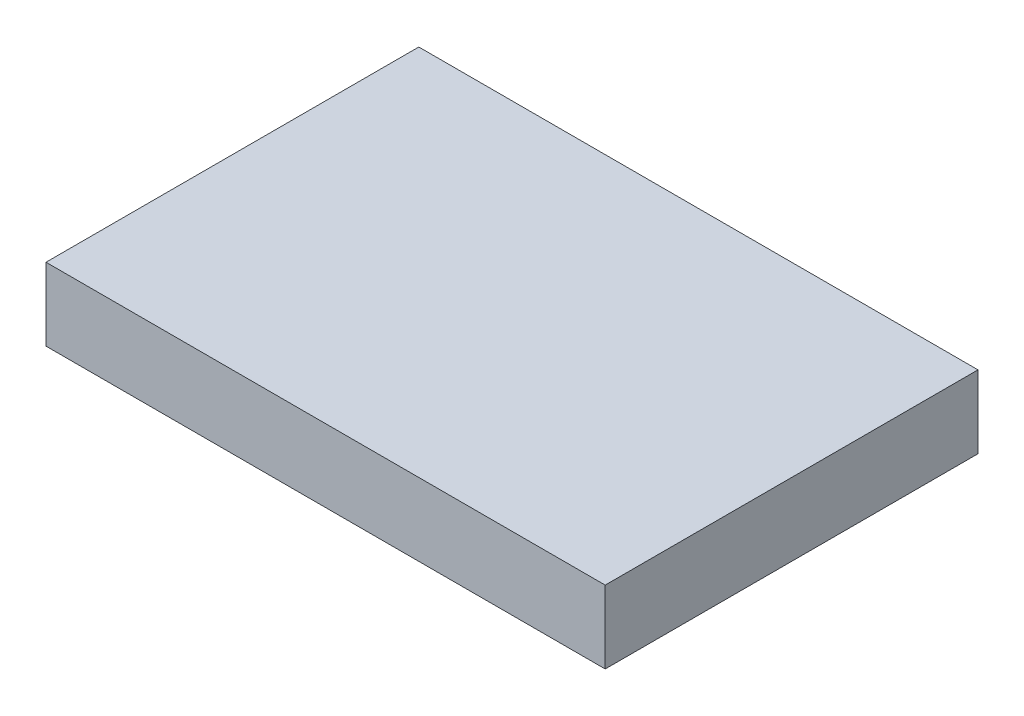
ISO-10303-21;
HEADER;
FILE_DESCRIPTION(('STEP AP214'),'2;1');
FILE_NAME('part.step','',(''),(''),'','','');
FILE_SCHEMA(('AUTOMOTIVE_DESIGN { 1 0 10303 214 1 1 1 1 }'));
ENDSEC;
DATA;
#1=APPLICATION_CONTEXT('core data for automotive mechanical design processes');
#2=APPLICATION_PROTOCOL_DEFINITION('international standard','automotive_design',2000,#1);
#3=PRODUCT_CONTEXT('',#1,'mechanical');
#4=PRODUCT('Part','Part','',(#3));
#5=PRODUCT_RELATED_PRODUCT_CATEGORY('part','',(#4));
#6=PRODUCT_DEFINITION_FORMATION('','',#4);
#7=PRODUCT_DEFINITION_CONTEXT('part definition',#1,'design');
#8=PRODUCT_DEFINITION('design','',#6,#7);
#9=PRODUCT_DEFINITION_SHAPE('','',#8);
#10=(LENGTH_UNIT() NAMED_UNIT(*) SI_UNIT(.MILLI.,.METRE.));
#11=(NAMED_UNIT(*) PLANE_ANGLE_UNIT() SI_UNIT($,.RADIAN.));
#12=(NAMED_UNIT(*) SI_UNIT($,.STERADIAN.) SOLID_ANGLE_UNIT());
#13=UNCERTAINTY_MEASURE_WITH_UNIT(LENGTH_MEASURE(1.E-05),#10,'distance_accuracy_value','');
#14=(GEOMETRIC_REPRESENTATION_CONTEXT(3) GLOBAL_UNCERTAINTY_ASSIGNED_CONTEXT((#13)) GLOBAL_UNIT_ASSIGNED_CONTEXT((#10,
#11,#12)) REPRESENTATION_CONTEXT('',''));
#15=CARTESIAN_POINT('',(0.,0.,0.));
#16=DIRECTION('',(0.,0.,1.));
#17=DIRECTION('',(1.,0.,0.));
#18=AXIS2_PLACEMENT_3D('',#15,#16,#17);
#19=CARTESIAN_POINT('',(0.,1.9,0.));
#20=DIRECTION('',(0.,-1.,0.));
#21=DIRECTION('',(0.,0.,-1.));
#22=AXIS2_PLACEMENT_3D('',#19,#20,#21);
#23=PLANE('',#22);
#24=CARTESIAN_POINT('',(-4.02500000000004,1.9,0.));
#25=DIRECTION('',(0.,-1.,0.));
#26=DIRECTION('',(0.,0.,-1.));
#27=AXIS2_PLACEMENT_3D('',#24,#25,#26);
#28=CIRCLE('',#27,2.4);
#29=CARTESIAN_POINT('',(-4.02500000000004,1.9,-2.40000000000009));
#30=VERTEX_POINT('',#29);
#31=EDGE_CURVE('E48',#30,#30,#28,.F.);
#32=ORIENTED_EDGE('',*,*,#31,.F.);
#33=EDGE_LOOP('',(#32));
#34=FACE_BOUND('',#33,.T.);
#35=ADVANCED_FACE('F39',(#34),#23,.T.);
#36=CARTESIAN_POINT('',(-4.02500000000004,-9.05096679918781,0.));
#37=DIRECTION('',(0.,1.,0.));
#38=DIRECTION('',(0.,0.,1.));
#39=AXIS2_PLACEMENT_3D('',#36,#37,#38);
#40=CYLINDRICAL_SURFACE('',#39,3.2);
#41=CARTESIAN_POINT('',(-4.02500000000004,1.9,0.));
#42=DIRECTION('',(0.,-1.,0.));
#43=DIRECTION('',(0.,0.,-1.));
#44=AXIS2_PLACEMENT_3D('',#41,#42,#43);
#45=CIRCLE('',#44,3.2);
#46=CARTESIAN_POINT('',(-4.02500000000004,1.9,-3.2000000000001));
#47=VERTEX_POINT('',#46);
#48=EDGE_CURVE('E11',#47,#47,#45,.T.);
#49=ORIENTED_EDGE('',*,*,#48,.T.);
#50=EDGE_LOOP('',(#49));
#51=FACE_BOUND('',#50,.T.);
#52=CARTESIAN_POINT('',(-4.02500000000004,0.,0.));
#53=DIRECTION('',(0.,-1.,0.));
#54=DIRECTION('',(0.,0.,-1.));
#55=AXIS2_PLACEMENT_3D('',#52,#53,#54);
#56=CIRCLE('',#55,3.2);
#57=CARTESIAN_POINT('',(-4.02500000000004,0.,-3.2000000000001));
#58=VERTEX_POINT('',#57);
#59=EDGE_CURVE('E213',#58,#58,#56,.T.);
#60=ORIENTED_EDGE('',*,*,#59,.F.);
#61=EDGE_LOOP('',(#60));
#62=FACE_BOUND('',#61,.T.);
#63=ADVANCED_FACE('F41',(#51,#62),#40,.T.);
#64=CARTESIAN_POINT('',(-4.02500000000004,-9.05096679918781,0.));
#65=DIRECTION('',(0.,1.,0.));
#66=DIRECTION('',(0.,0.,1.));
#67=AXIS2_PLACEMENT_3D('',#64,#65,#66);
#68=CYLINDRICAL_SURFACE('',#67,2.4);
#69=ORIENTED_EDGE('',*,*,#31,.T.);
#70=EDGE_LOOP('',(#69));
#71=FACE_BOUND('',#70,.T.);
#72=CARTESIAN_POINT('',(-4.02500000000004,0.,0.));
#73=DIRECTION('',(0.,-1.,0.));
#74=DIRECTION('',(0.,0.,-1.));
#75=AXIS2_PLACEMENT_3D('',#72,#73,#74);
#76=CIRCLE('',#75,2.4);
#77=CARTESIAN_POINT('',(-4.02500000000004,0.,-2.40000000000009));
#78=VERTEX_POINT('',#77);
#79=EDGE_CURVE('E209',#78,#78,#76,.T.);
#80=ORIENTED_EDGE('',*,*,#79,.T.);
#81=EDGE_LOOP('',(#80));
#82=FACE_BOUND('',#81,.T.);
#83=ADVANCED_FACE('F220',(#71,#82),#68,.F.);
#84=CARTESIAN_POINT('',(-8.,0.,0.));
#85=DIRECTION('',(0.,-1.,0.));
#86=DIRECTION('',(0.,0.,-1.));
#87=AXIS2_PLACEMENT_3D('',#84,#85,#86);
#88=PLANE('',#87);
#89=ORIENTED_EDGE('',*,*,#79,.F.);
#90=EDGE_LOOP('',(#89));
#91=FACE_BOUND('',#90,.T.);
#92=ORIENTED_EDGE('',*,*,#59,.T.);
#93=EDGE_LOOP('',(#92));
#94=FACE_BOUND('',#93,.T.);
#95=ADVANCED_FACE('F329',(#91,#94),#88,.T.);
#96=CARTESIAN_POINT('',(0.,0.,0.));
#97=DIRECTION('',(0.,-1.,0.));
#98=DIRECTION('',(0.,0.,-1.));
#99=AXIS2_PLACEMENT_3D('',#96,#97,#98);
#100=PLANE('',#99);
#101=DIRECTION('',(0.,0.,-1.));
#102=VECTOR('',#101,1.);
#103=CARTESIAN_POINT('',(11.925,0.,7.94999999999991));
#104=LINE('',#103,#102);
#105=CARTESIAN_POINT('',(11.925,0.,7.94999999999991));
#106=VERTEX_POINT('',#105);
#107=CARTESIAN_POINT('',(11.925,0.,-7.9500000000001));
#108=VERTEX_POINT('',#107);
#109=EDGE_CURVE('E141',#106,#108,#104,.T.);
#110=ORIENTED_EDGE('',*,*,#109,.F.);
#111=DIRECTION('',(1.,0.,0.));
#112=VECTOR('',#111,1.);
#113=CARTESIAN_POINT('',(-11.925,0.,7.94999999999991));
#114=LINE('',#113,#112);
#115=CARTESIAN_POINT('',(-11.925,0.,7.94999999999991));
#116=VERTEX_POINT('',#115);
#117=EDGE_CURVE('E85',#116,#106,#114,.T.);
#118=ORIENTED_EDGE('',*,*,#117,.F.);
#119=DIRECTION('',(0.,0.,1.));
#120=VECTOR('',#119,1.);
#121=CARTESIAN_POINT('',(-11.925,0.,7.94999999999991));
#122=LINE('',#121,#120);
#123=CARTESIAN_POINT('',(-11.925,0.,-7.9500000000001));
#124=VERTEX_POINT('',#123);
#125=EDGE_CURVE('E188',#124,#116,#122,.T.);
#126=ORIENTED_EDGE('',*,*,#125,.F.);
#127=DIRECTION('',(-1.,0.,0.));
#128=VECTOR('',#127,1.);
#129=CARTESIAN_POINT('',(-11.925,0.,-7.9500000000001));
#130=LINE('',#129,#128);
#131=EDGE_CURVE('E147',#108,#124,#130,.T.);
#132=ORIENTED_EDGE('',*,*,#131,.F.);
#133=EDGE_LOOP('',(#110,#118,#126,#132));
#134=FACE_BOUND('',#133,.T.);
#135=DIRECTION('',(1.,0.,0.));
#136=VECTOR('',#135,1.);
#137=CARTESIAN_POINT('',(0.,0.,6.7499999999999));
#138=LINE('',#137,#136);
#139=CARTESIAN_POINT('',(-10.725,0.,6.7499999999999));
#140=VERTEX_POINT('',#139);
#141=CARTESIAN_POINT('',(10.725,0.,6.7499999999999));
#142=VERTEX_POINT('',#141);
#143=EDGE_CURVE('E135',#140,#142,#138,.T.);
#144=ORIENTED_EDGE('',*,*,#143,.T.);
#145=DIRECTION('',(0.,0.,-1.));
#146=VECTOR('',#145,1.);
#147=CARTESIAN_POINT('',(10.725,0.,0.));
#148=LINE('',#147,#146);
#149=CARTESIAN_POINT('',(10.725,0.,-6.7500000000001));
#150=VERTEX_POINT('',#149);
#151=EDGE_CURVE('E164',#142,#150,#148,.T.);
#152=ORIENTED_EDGE('',*,*,#151,.T.);
#153=DIRECTION('',(-1.,0.,0.));
#154=VECTOR('',#153,1.);
#155=CARTESIAN_POINT('',(0.,0.,-6.7500000000001));
#156=LINE('',#155,#154);
#157=CARTESIAN_POINT('',(-10.725,0.,-6.7500000000001));
#158=VERTEX_POINT('',#157);
#159=EDGE_CURVE('E139',#150,#158,#156,.T.);
#160=ORIENTED_EDGE('',*,*,#159,.T.);
#161=DIRECTION('',(0.,0.,1.));
#162=VECTOR('',#161,1.);
#163=CARTESIAN_POINT('',(-10.725,0.,0.));
#164=LINE('',#163,#162);
#165=EDGE_CURVE('E55',#158,#140,#164,.T.);
#166=ORIENTED_EDGE('',*,*,#165,.T.);
#167=EDGE_LOOP('',(#144,#152,#160,#166));
#168=FACE_BOUND('',#167,.T.);
#169=ADVANCED_FACE('F336',(#134,#168),#100,.T.);
#170=CARTESIAN_POINT('',(11.925,3.1,7.94999999999991));
#171=DIRECTION('',(-1.,0.,0.));
#172=DIRECTION('',(0.,0.,1.));
#173=AXIS2_PLACEMENT_3D('',#170,#171,#172);
#174=PLANE('',#173);
#175=ORIENTED_EDGE('',*,*,#109,.T.);
#176=DIRECTION('',(0.,-1.,0.));
#177=VECTOR('',#176,1.);
#178=CARTESIAN_POINT('',(11.925,3.1,-7.9500000000001));
#179=LINE('',#178,#177);
#180=CARTESIAN_POINT('',(11.925,3.1,-7.9500000000001));
#181=VERTEX_POINT('',#180);
#182=EDGE_CURVE('E202',#181,#108,#179,.T.);
#183=ORIENTED_EDGE('',*,*,#182,.F.);
#184=DIRECTION('',(0.,0.,-1.));
#185=VECTOR('',#184,1.);
#186=CARTESIAN_POINT('',(11.925,3.1,7.94999999999991));
#187=LINE('',#186,#185);
#188=CARTESIAN_POINT('',(11.925,3.1,7.94999999999991));
#189=VERTEX_POINT('',#188);
#190=EDGE_CURVE('E175',#189,#181,#187,.T.);
#191=ORIENTED_EDGE('',*,*,#190,.F.);
#192=DIRECTION('',(0.,-1.,0.));
#193=VECTOR('',#192,1.);
#194=CARTESIAN_POINT('',(11.925,3.1,7.94999999999991));
#195=LINE('',#194,#193);
#196=EDGE_CURVE('E184',#189,#106,#195,.T.);
#197=ORIENTED_EDGE('',*,*,#196,.T.);
#198=EDGE_LOOP('',(#175,#183,#191,#197));
#199=FACE_BOUND('',#198,.T.);
#200=ADVANCED_FACE('F349',(#199),#174,.F.);
#201=CARTESIAN_POINT('',(-11.925,3.1,-7.9500000000001));
#202=DIRECTION('',(0.,0.,1.));
#203=DIRECTION('',(1.,0.,0.));
#204=AXIS2_PLACEMENT_3D('',#201,#202,#203);
#205=PLANE('',#204);
#206=ORIENTED_EDGE('',*,*,#131,.T.);
#207=DIRECTION('',(0.,-1.,0.));
#208=VECTOR('',#207,1.);
#209=CARTESIAN_POINT('',(-11.925,3.1,-7.9500000000001));
#210=LINE('',#209,#208);
#211=CARTESIAN_POINT('',(-11.925,3.1,-7.9500000000001));
#212=VERTEX_POINT('',#211);
#213=EDGE_CURVE('E198',#212,#124,#210,.T.);
#214=ORIENTED_EDGE('',*,*,#213,.F.);
#215=DIRECTION('',(-1.,0.,0.));
#216=VECTOR('',#215,1.);
#217=CARTESIAN_POINT('',(-11.925,3.1,-7.9500000000001));
#218=LINE('',#217,#216);
#219=EDGE_CURVE('E93',#181,#212,#218,.T.);
#220=ORIENTED_EDGE('',*,*,#219,.F.);
#221=ORIENTED_EDGE('',*,*,#182,.T.);
#222=EDGE_LOOP('',(#206,#214,#220,#221));
#223=FACE_BOUND('',#222,.T.);
#224=ADVANCED_FACE('F359',(#223),#205,.F.);
#225=CARTESIAN_POINT('',(-11.925,3.1,7.94999999999991));
#226=DIRECTION('',(1.,0.,0.));
#227=DIRECTION('',(0.,0.,-1.));
#228=AXIS2_PLACEMENT_3D('',#225,#226,#227);
#229=PLANE('',#228);
#230=ORIENTED_EDGE('',*,*,#125,.T.);
#231=DIRECTION('',(0.,-1.,0.));
#232=VECTOR('',#231,1.);
#233=CARTESIAN_POINT('',(-11.925,3.1,7.94999999999991));
#234=LINE('',#233,#232);
#235=CARTESIAN_POINT('',(-11.925,3.1,7.94999999999991));
#236=VERTEX_POINT('',#235);
#237=EDGE_CURVE('E195',#236,#116,#234,.T.);
#238=ORIENTED_EDGE('',*,*,#237,.F.);
#239=DIRECTION('',(0.,0.,1.));
#240=VECTOR('',#239,1.);
#241=CARTESIAN_POINT('',(-11.925,3.1,7.94999999999991));
#242=LINE('',#241,#240);
#243=EDGE_CURVE('E180',#212,#236,#242,.T.);
#244=ORIENTED_EDGE('',*,*,#243,.F.);
#245=ORIENTED_EDGE('',*,*,#213,.T.);
#246=EDGE_LOOP('',(#230,#238,#244,#245));
#247=FACE_BOUND('',#246,.T.);
#248=ADVANCED_FACE('F367',(#247),#229,.F.);
#249=CARTESIAN_POINT('',(-11.925,3.1,7.94999999999991));
#250=DIRECTION('',(0.,0.,-1.));
#251=DIRECTION('',(-1.,0.,0.));
#252=AXIS2_PLACEMENT_3D('',#249,#250,#251);
#253=PLANE('',#252);
#254=ORIENTED_EDGE('',*,*,#117,.T.);
#255=ORIENTED_EDGE('',*,*,#196,.F.);
#256=DIRECTION('',(1.,0.,0.));
#257=VECTOR('',#256,1.);
#258=CARTESIAN_POINT('',(-11.925,3.1,7.94999999999991));
#259=LINE('',#258,#257);
#260=EDGE_CURVE('E64',#236,#189,#259,.T.);
#261=ORIENTED_EDGE('',*,*,#260,.F.);
#262=ORIENTED_EDGE('',*,*,#237,.T.);
#263=EDGE_LOOP('',(#254,#255,#261,#262));
#264=FACE_BOUND('',#263,.T.);
#265=ADVANCED_FACE('F374',(#264),#253,.F.);
#266=CARTESIAN_POINT('',(0.,3.1,0.));
#267=DIRECTION('',(0.,-1.,0.));
#268=DIRECTION('',(0.,0.,-1.));
#269=AXIS2_PLACEMENT_3D('',#266,#267,#268);
#270=PLANE('',#269);
#271=ORIENTED_EDGE('',*,*,#190,.T.);
#272=ORIENTED_EDGE('',*,*,#219,.T.);
#273=ORIENTED_EDGE('',*,*,#243,.T.);
#274=ORIENTED_EDGE('',*,*,#260,.T.);
#275=EDGE_LOOP('',(#271,#272,#273,#274));
#276=FACE_BOUND('',#275,.T.);
#277=ADVANCED_FACE('F275',(#276),#270,.F.);
#278=CARTESIAN_POINT('',(10.725,3.1,7.94999999999991));
#279=DIRECTION('',(-1.,0.,0.));
#280=DIRECTION('',(0.,0.,1.));
#281=AXIS2_PLACEMENT_3D('',#278,#279,#280);
#282=PLANE('',#281);
#283=ORIENTED_EDGE('',*,*,#151,.F.);
#284=DIRECTION('',(0.,-1.,0.));
#285=VECTOR('',#284,1.);
#286=CARTESIAN_POINT('',(10.725,3.1,6.7499999999999));
#287=LINE('',#286,#285);
#288=CARTESIAN_POINT('',(10.725,1.9,6.7499999999999));
#289=VERTEX_POINT('',#288);
#290=EDGE_CURVE('E133',#289,#142,#287,.T.);
#291=ORIENTED_EDGE('',*,*,#290,.F.);
#292=DIRECTION('',(0.,0.,-1.));
#293=VECTOR('',#292,1.);
#294=CARTESIAN_POINT('',(10.725,1.9,0.));
#295=LINE('',#294,#293);
#296=CARTESIAN_POINT('',(10.725,1.9,-6.7500000000001));
#297=VERTEX_POINT('',#296);
#298=EDGE_CURVE('E120',#289,#297,#295,.T.);
#299=ORIENTED_EDGE('',*,*,#298,.T.);
#300=DIRECTION('',(0.,-1.,0.));
#301=VECTOR('',#300,1.);
#302=CARTESIAN_POINT('',(10.725,3.1,-6.7500000000001));
#303=LINE('',#302,#301);
#304=EDGE_CURVE('E131',#297,#150,#303,.T.);
#305=ORIENTED_EDGE('',*,*,#304,.T.);
#306=EDGE_LOOP('',(#283,#291,#299,#305));
#307=FACE_BOUND('',#306,.T.);
#308=ADVANCED_FACE('F130',(#307),#282,.T.);
#309=CARTESIAN_POINT('',(-11.925,3.1,-6.7500000000001));
#310=DIRECTION('',(0.,0.,1.));
#311=DIRECTION('',(1.,0.,0.));
#312=AXIS2_PLACEMENT_3D('',#309,#310,#311);
#313=PLANE('',#312);
#314=ORIENTED_EDGE('',*,*,#159,.F.);
#315=ORIENTED_EDGE('',*,*,#304,.F.);
#316=DIRECTION('',(-1.,0.,0.));
#317=VECTOR('',#316,1.);
#318=CARTESIAN_POINT('',(0.,1.9,-6.7500000000001));
#319=LINE('',#318,#317);
#320=CARTESIAN_POINT('',(-10.725,1.9,-6.7500000000001));
#321=VERTEX_POINT('',#320);
#322=EDGE_CURVE('E116',#297,#321,#319,.T.);
#323=ORIENTED_EDGE('',*,*,#322,.T.);
#324=DIRECTION('',(0.,-1.,0.));
#325=VECTOR('',#324,1.);
#326=CARTESIAN_POINT('',(-10.725,3.1,-6.7500000000001));
#327=LINE('',#326,#325);
#328=EDGE_CURVE('E142',#321,#158,#327,.T.);
#329=ORIENTED_EDGE('',*,*,#328,.T.);
#330=EDGE_LOOP('',(#314,#315,#323,#329));
#331=FACE_BOUND('',#330,.T.);
#332=ADVANCED_FACE('F137',(#331),#313,.T.);
#333=CARTESIAN_POINT('',(-10.725,3.1,7.94999999999991));
#334=DIRECTION('',(1.,0.,0.));
#335=DIRECTION('',(0.,0.,-1.));
#336=AXIS2_PLACEMENT_3D('',#333,#334,#335);
#337=PLANE('',#336);
#338=ORIENTED_EDGE('',*,*,#165,.F.);
#339=ORIENTED_EDGE('',*,*,#328,.F.);
#340=DIRECTION('',(0.,0.,1.));
#341=VECTOR('',#340,1.);
#342=CARTESIAN_POINT('',(-10.725,1.9,0.));
#343=LINE('',#342,#341);
#344=CARTESIAN_POINT('',(-10.725,1.9,6.7499999999999));
#345=VERTEX_POINT('',#344);
#346=EDGE_CURVE('E121',#321,#345,#343,.T.);
#347=ORIENTED_EDGE('',*,*,#346,.T.);
#348=DIRECTION('',(0.,-1.,0.));
#349=VECTOR('',#348,1.);
#350=CARTESIAN_POINT('',(-10.725,3.1,6.7499999999999));
#351=LINE('',#350,#349);
#352=EDGE_CURVE('E149',#345,#140,#351,.T.);
#353=ORIENTED_EDGE('',*,*,#352,.T.);
#354=EDGE_LOOP('',(#338,#339,#347,#353));
#355=FACE_BOUND('',#354,.T.);
#356=ADVANCED_FACE('F246',(#355),#337,.T.);
#357=CARTESIAN_POINT('',(-11.925,3.1,6.7499999999999));
#358=DIRECTION('',(0.,0.,-1.));
#359=DIRECTION('',(-1.,0.,0.));
#360=AXIS2_PLACEMENT_3D('',#357,#358,#359);
#361=PLANE('',#360);
#362=ORIENTED_EDGE('',*,*,#143,.F.);
#363=ORIENTED_EDGE('',*,*,#352,.F.);
#364=DIRECTION('',(1.,0.,0.));
#365=VECTOR('',#364,1.);
#366=CARTESIAN_POINT('',(0.,1.9,6.7499999999999));
#367=LINE('',#366,#365);
#368=EDGE_CURVE('E156',#345,#289,#367,.T.);
#369=ORIENTED_EDGE('',*,*,#368,.T.);
#370=ORIENTED_EDGE('',*,*,#290,.T.);
#371=EDGE_LOOP('',(#362,#363,#369,#370));
#372=FACE_BOUND('',#371,.T.);
#373=ADVANCED_FACE('F237',(#372),#361,.T.);
#374=ORIENTED_EDGE('',*,*,#48,.F.);
#375=EDGE_LOOP('',(#374));
#376=FACE_BOUND('',#375,.T.);
#377=CARTESIAN_POINT('',(3.97499999999996,1.9,0.));
#378=DIRECTION('',(0.,-1.,0.));
#379=DIRECTION('',(0.,0.,-1.));
#380=AXIS2_PLACEMENT_3D('',#377,#378,#379);
#381=CIRCLE('',#380,3.2);
#382=CARTESIAN_POINT('',(3.97499999999996,1.9,-3.2000000000001));
#383=VERTEX_POINT('',#382);
#384=EDGE_CURVE('E252',#383,#383,#381,.T.);
#385=ORIENTED_EDGE('',*,*,#384,.F.);
#386=EDGE_LOOP('',(#385));
#387=FACE_BOUND('',#386,.T.);
#388=ORIENTED_EDGE('',*,*,#298,.F.);
#389=ORIENTED_EDGE('',*,*,#368,.F.);
#390=ORIENTED_EDGE('',*,*,#346,.F.);
#391=ORIENTED_EDGE('',*,*,#322,.F.);
#392=EDGE_LOOP('',(#388,#389,#390,#391));
#393=FACE_BOUND('',#392,.T.);
#394=ADVANCED_FACE('F118',(#376,#387,#393),#23,.T.);
#395=CARTESIAN_POINT('',(3.97499999999996,-9.05096679918781,0.));
#396=DIRECTION('',(0.,1.,0.));
#397=DIRECTION('',(0.,0.,1.));
#398=AXIS2_PLACEMENT_3D('',#395,#396,#397);
#399=CYLINDRICAL_SURFACE('',#398,3.2);
#400=ORIENTED_EDGE('',*,*,#384,.T.);
#401=EDGE_LOOP('',(#400));
#402=FACE_BOUND('',#401,.T.);
#403=CARTESIAN_POINT('',(3.97499999999996,0.,0.));
#404=DIRECTION('',(0.,-1.,0.));
#405=DIRECTION('',(0.,0.,-1.));
#406=AXIS2_PLACEMENT_3D('',#403,#404,#405);
#407=CIRCLE('',#406,3.2);
#408=CARTESIAN_POINT('',(3.97499999999996,0.,-3.2000000000001));
#409=VERTEX_POINT('',#408);
#410=EDGE_CURVE('E167',#409,#409,#407,.T.);
#411=ORIENTED_EDGE('',*,*,#410,.F.);
#412=EDGE_LOOP('',(#411));
#413=FACE_BOUND('',#412,.T.);
#414=ADVANCED_FACE('F236',(#402,#413),#399,.T.);
#415=CARTESIAN_POINT('',(3.97499999999996,-9.05096679918781,0.));
#416=DIRECTION('',(0.,1.,0.));
#417=DIRECTION('',(0.,0.,1.));
#418=AXIS2_PLACEMENT_3D('',#415,#416,#417);
#419=CYLINDRICAL_SURFACE('',#418,2.4);
#420=CARTESIAN_POINT('',(3.97499999999996,1.9,0.));
#421=DIRECTION('',(0.,-1.,0.));
#422=DIRECTION('',(0.,0.,-1.));
#423=AXIS2_PLACEMENT_3D('',#420,#421,#422);
#424=CIRCLE('',#423,2.4);
#425=CARTESIAN_POINT('',(3.97499999999996,1.9,-2.40000000000009));
#426=VERTEX_POINT('',#425);
#427=EDGE_CURVE('E205',#426,#426,#424,.F.);
#428=ORIENTED_EDGE('',*,*,#427,.T.);
#429=EDGE_LOOP('',(#428));
#430=FACE_BOUND('',#429,.T.);
#431=CARTESIAN_POINT('',(3.97499999999996,0.,0.));
#432=DIRECTION('',(0.,-1.,0.));
#433=DIRECTION('',(0.,0.,-1.));
#434=AXIS2_PLACEMENT_3D('',#431,#432,#433);
#435=CIRCLE('',#434,2.4);
#436=CARTESIAN_POINT('',(3.97499999999996,0.,-2.40000000000009));
#437=VERTEX_POINT('',#436);
#438=EDGE_CURVE('E152',#437,#437,#435,.T.);
#439=ORIENTED_EDGE('',*,*,#438,.T.);
#440=EDGE_LOOP('',(#439));
#441=FACE_BOUND('',#440,.T.);
#442=ADVANCED_FACE('F243',(#430,#441),#419,.F.);
#443=CARTESIAN_POINT('',(0.,0.,0.));
#444=DIRECTION('',(0.,-1.,0.));
#445=DIRECTION('',(0.,0.,-1.));
#446=AXIS2_PLACEMENT_3D('',#443,#444,#445);
#447=PLANE('',#446);
#448=ORIENTED_EDGE('',*,*,#438,.F.);
#449=EDGE_LOOP('',(#448));
#450=FACE_BOUND('',#449,.T.);
#451=ORIENTED_EDGE('',*,*,#410,.T.);
#452=EDGE_LOOP('',(#451));
#453=FACE_BOUND('',#452,.T.);
#454=ADVANCED_FACE('F233',(#450,#453),#447,.T.);
#455=ORIENTED_EDGE('',*,*,#427,.F.);
#456=EDGE_LOOP('',(#455));
#457=FACE_BOUND('',#456,.T.);
#458=ADVANCED_FACE('F225',(#457),#23,.T.);
#459=CLOSED_SHELL('',(#35,#63,#83,#95,#169,#200,#224,#248,#265,#277,#308,#332,#356,#373,#394,
#414,#442,#454,#458));
#460=MANIFOLD_SOLID_BREP('B2',#459);
#461=ADVANCED_BREP_SHAPE_REPRESENTATION('',(#18,#460),#14);
#462=SHAPE_DEFINITION_REPRESENTATION(#9,#461);
ENDSEC;
END-ISO-10303-21;
